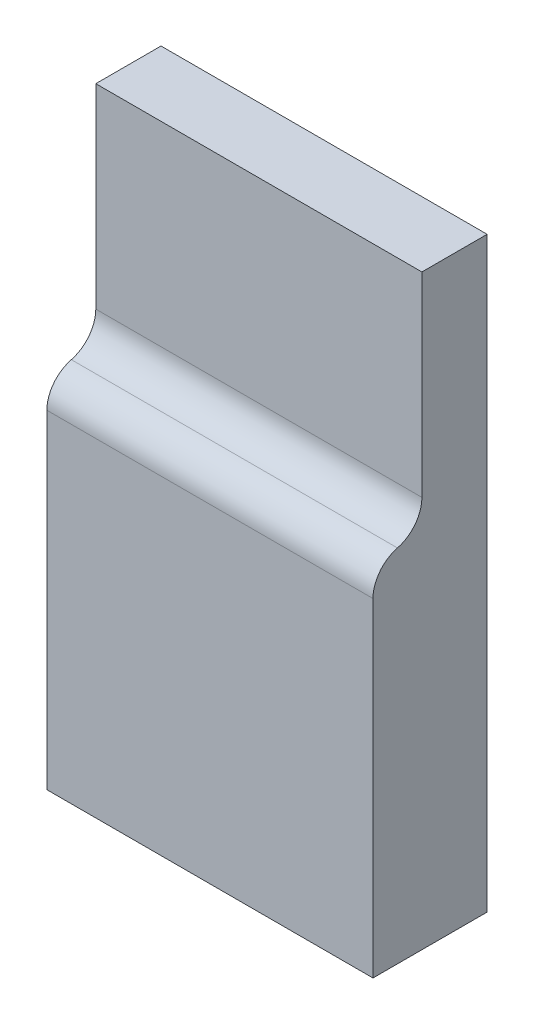
ISO-10303-21;
HEADER;
FILE_DESCRIPTION(('STEP AP214'),'2;1');
FILE_NAME('part.step','',(''),(''),'','','');
FILE_SCHEMA(('AUTOMOTIVE_DESIGN { 1 0 10303 214 1 1 1 1 }'));
ENDSEC;
DATA;
#1=APPLICATION_CONTEXT('core data for automotive mechanical design processes');
#2=APPLICATION_PROTOCOL_DEFINITION('international standard','automotive_design',2000,#1);
#3=PRODUCT_CONTEXT('',#1,'mechanical');
#4=PRODUCT('Part','Part','',(#3));
#5=PRODUCT_RELATED_PRODUCT_CATEGORY('part','',(#4));
#6=PRODUCT_DEFINITION_FORMATION('','',#4);
#7=PRODUCT_DEFINITION_CONTEXT('part definition',#1,'design');
#8=PRODUCT_DEFINITION('design','',#6,#7);
#9=PRODUCT_DEFINITION_SHAPE('','',#8);
#10=(LENGTH_UNIT() NAMED_UNIT(*) SI_UNIT(.MILLI.,.METRE.));
#11=(NAMED_UNIT(*) PLANE_ANGLE_UNIT() SI_UNIT($,.RADIAN.));
#12=(NAMED_UNIT(*) SI_UNIT($,.STERADIAN.) SOLID_ANGLE_UNIT());
#13=UNCERTAINTY_MEASURE_WITH_UNIT(LENGTH_MEASURE(1.E-05),#10,'distance_accuracy_value','');
#14=(GEOMETRIC_REPRESENTATION_CONTEXT(3) GLOBAL_UNCERTAINTY_ASSIGNED_CONTEXT((#13)) GLOBAL_UNIT_ASSIGNED_CONTEXT((#10,
#11,#12)) REPRESENTATION_CONTEXT('',''));
#15=CARTESIAN_POINT('',(0.,0.,0.));
#16=DIRECTION('',(0.,0.,1.));
#17=DIRECTION('',(1.,0.,0.));
#18=AXIS2_PLACEMENT_3D('',#15,#16,#17);
#19=CARTESIAN_POINT('',(0.,0.,20.));
#20=DIRECTION('',(0.,0.,-1.));
#21=DIRECTION('',(-1.,0.,0.));
#22=AXIS2_PLACEMENT_3D('',#19,#20,#21);
#23=PLANE('',#22);
#24=DIRECTION('',(0.,-1.,0.));
#25=VECTOR('',#24,1.);
#26=CARTESIAN_POINT('',(-50.,-90.,20.));
#27=LINE('',#26,#25);
#28=CARTESIAN_POINT('',(-50.,90.,20.));
#29=VERTEX_POINT('',#28);
#30=CARTESIAN_POINT('',(-50.,30.1375025819866,20.));
#31=VERTEX_POINT('',#30);
#32=EDGE_CURVE('E132',#29,#31,#27,.T.);
#33=ORIENTED_EDGE('',*,*,#32,.T.);
#34=DIRECTION('',(1.,0.,0.));
#35=VECTOR('',#34,1.);
#36=CARTESIAN_POINT('',(0.,30.1375025819867,20.));
#37=LINE('',#36,#35);
#38=CARTESIAN_POINT('',(50.,30.1375025819866,20.));
#39=VERTEX_POINT('',#38);
#40=EDGE_CURVE('E58',#31,#39,#37,.T.);
#41=ORIENTED_EDGE('',*,*,#40,.T.);
#42=DIRECTION('',(0.,1.,0.));
#43=VECTOR('',#42,1.);
#44=CARTESIAN_POINT('',(50.,-90.,20.));
#45=LINE('',#44,#43);
#46=CARTESIAN_POINT('',(50.,90.,20.));
#47=VERTEX_POINT('',#46);
#48=EDGE_CURVE('E127',#39,#47,#45,.T.);
#49=ORIENTED_EDGE('',*,*,#48,.T.);
#50=DIRECTION('',(-1.,0.,0.));
#51=VECTOR('',#50,1.);
#52=CARTESIAN_POINT('',(-50.,90.,20.));
#53=LINE('',#52,#51);
#54=EDGE_CURVE('E129',#47,#29,#53,.T.);
#55=ORIENTED_EDGE('',*,*,#54,.T.);
#56=EDGE_LOOP('',(#33,#41,#49,#55));
#57=FACE_BOUND('',#56,.T.);
#58=ADVANCED_FACE('F37',(#57),#23,.F.);
#59=CARTESIAN_POINT('',(50.,-90.,20.));
#60=DIRECTION('',(-1.,0.,0.));
#61=DIRECTION('',(0.,0.,1.));
#62=AXIS2_PLACEMENT_3D('',#59,#60,#61);
#63=PLANE('',#62);
#64=ORIENTED_EDGE('',*,*,#48,.F.);
#65=CARTESIAN_POINT('',(50.,30.1375025819867,30.));
#66=DIRECTION('',(-1.,0.,0.));
#67=DIRECTION('',(0.,0.,1.));
#68=AXIS2_PLACEMENT_3D('',#65,#66,#67);
#69=CIRCLE('',#68,10.);
#70=CARTESIAN_POINT('',(50.,20.4550442164681,27.5));
#71=VERTEX_POINT('',#70);
#72=EDGE_CURVE('E11',#39,#71,#69,.T.);
#73=ORIENTED_EDGE('',*,*,#72,.T.);
#74=CARTESIAN_POINT('',(50.,10.7725858509496,25.));
#75=DIRECTION('',(-1.,0.,0.));
#76=DIRECTION('',(0.,0.,1.));
#77=AXIS2_PLACEMENT_3D('',#74,#75,#76);
#78=CIRCLE('',#77,10.);
#79=CARTESIAN_POINT('',(50.,10.7725858509496,35.));
#80=VERTEX_POINT('',#79);
#81=EDGE_CURVE('E145',#71,#80,#78,.F.);
#82=ORIENTED_EDGE('',*,*,#81,.T.);
#83=DIRECTION('',(0.,1.,0.));
#84=VECTOR('',#83,1.);
#85=CARTESIAN_POINT('',(50.,20.7725858509496,35.));
#86=LINE('',#85,#84);
#87=CARTESIAN_POINT('',(50.,-90.,35.));
#88=VERTEX_POINT('',#87);
#89=EDGE_CURVE('E105',#88,#80,#86,.T.);
#90=ORIENTED_EDGE('',*,*,#89,.F.);
#91=DIRECTION('',(0.,0.,-1.));
#92=VECTOR('',#91,1.);
#93=CARTESIAN_POINT('',(50.,-90.,20.));
#94=LINE('',#93,#92);
#95=CARTESIAN_POINT('',(50.,-90.,0.));
#96=VERTEX_POINT('',#95);
#97=EDGE_CURVE('E116',#88,#96,#94,.T.);
#98=ORIENTED_EDGE('',*,*,#97,.T.);
#99=DIRECTION('',(0.,1.,0.));
#100=VECTOR('',#99,1.);
#101=CARTESIAN_POINT('',(50.,-90.,0.));
#102=LINE('',#101,#100);
#103=CARTESIAN_POINT('',(50.,90.,0.));
#104=VERTEX_POINT('',#103);
#105=EDGE_CURVE('E120',#96,#104,#102,.T.);
#106=ORIENTED_EDGE('',*,*,#105,.T.);
#107=DIRECTION('',(0.,0.,-1.));
#108=VECTOR('',#107,1.);
#109=CARTESIAN_POINT('',(50.,90.,20.));
#110=LINE('',#109,#108);
#111=EDGE_CURVE('E139',#47,#104,#110,.T.);
#112=ORIENTED_EDGE('',*,*,#111,.F.);
#113=EDGE_LOOP('',(#64,#73,#82,#90,#98,#106,#112));
#114=FACE_BOUND('',#113,.T.);
#115=ADVANCED_FACE('F157',(#114),#63,.F.);
#116=CARTESIAN_POINT('',(-50.,90.,20.));
#117=DIRECTION('',(0.,-1.,0.));
#118=DIRECTION('',(0.,0.,-1.));
#119=AXIS2_PLACEMENT_3D('',#116,#117,#118);
#120=PLANE('',#119);
#121=DIRECTION('',(-1.,0.,0.));
#122=VECTOR('',#121,1.);
#123=CARTESIAN_POINT('',(-50.,90.,0.));
#124=LINE('',#123,#122);
#125=CARTESIAN_POINT('',(-50.,90.,0.));
#126=VERTEX_POINT('',#125);
#127=EDGE_CURVE('E123',#104,#126,#124,.T.);
#128=ORIENTED_EDGE('',*,*,#127,.T.);
#129=DIRECTION('',(0.,0.,-1.));
#130=VECTOR('',#129,1.);
#131=CARTESIAN_POINT('',(-50.,90.,20.));
#132=LINE('',#131,#130);
#133=EDGE_CURVE('E115',#29,#126,#132,.T.);
#134=ORIENTED_EDGE('',*,*,#133,.F.);
#135=ORIENTED_EDGE('',*,*,#54,.F.);
#136=ORIENTED_EDGE('',*,*,#111,.T.);
#137=EDGE_LOOP('',(#128,#134,#135,#136));
#138=FACE_BOUND('',#137,.T.);
#139=ADVANCED_FACE('F162',(#138),#120,.F.);
#140=CARTESIAN_POINT('',(-50.,-90.,20.));
#141=DIRECTION('',(1.,0.,0.));
#142=DIRECTION('',(0.,0.,-1.));
#143=AXIS2_PLACEMENT_3D('',#140,#141,#142);
#144=PLANE('',#143);
#145=DIRECTION('',(0.,-1.,0.));
#146=VECTOR('',#145,1.);
#147=CARTESIAN_POINT('',(-50.,20.7725858509496,35.));
#148=LINE('',#147,#146);
#149=CARTESIAN_POINT('',(-50.,10.7725858509496,35.));
#150=VERTEX_POINT('',#149);
#151=CARTESIAN_POINT('',(-50.,-90.,35.));
#152=VERTEX_POINT('',#151);
#153=EDGE_CURVE('E96',#150,#152,#148,.T.);
#154=ORIENTED_EDGE('',*,*,#153,.F.);
#155=CARTESIAN_POINT('',(-50.,10.7725858509496,25.));
#156=DIRECTION('',(1.,0.,0.));
#157=DIRECTION('',(0.,0.,-1.));
#158=AXIS2_PLACEMENT_3D('',#155,#156,#157);
#159=CIRCLE('',#158,10.);
#160=CARTESIAN_POINT('',(-50.,20.4550442164681,27.5));
#161=VERTEX_POINT('',#160);
#162=EDGE_CURVE('E143',#150,#161,#159,.F.);
#163=ORIENTED_EDGE('',*,*,#162,.T.);
#164=CARTESIAN_POINT('',(-50.,30.1375025819867,30.));
#165=DIRECTION('',(1.,0.,0.));
#166=DIRECTION('',(0.,0.,-1.));
#167=AXIS2_PLACEMENT_3D('',#164,#165,#166);
#168=CIRCLE('',#167,10.);
#169=EDGE_CURVE('E45',#161,#31,#168,.T.);
#170=ORIENTED_EDGE('',*,*,#169,.T.);
#171=ORIENTED_EDGE('',*,*,#32,.F.);
#172=ORIENTED_EDGE('',*,*,#133,.T.);
#173=DIRECTION('',(0.,-1.,0.));
#174=VECTOR('',#173,1.);
#175=CARTESIAN_POINT('',(-50.,-90.,0.));
#176=LINE('',#175,#174);
#177=CARTESIAN_POINT('',(-50.,-90.,0.));
#178=VERTEX_POINT('',#177);
#179=EDGE_CURVE('E112',#126,#178,#176,.T.);
#180=ORIENTED_EDGE('',*,*,#179,.T.);
#181=DIRECTION('',(0.,0.,-1.));
#182=VECTOR('',#181,1.);
#183=CARTESIAN_POINT('',(-50.,-90.,20.));
#184=LINE('',#183,#182);
#185=EDGE_CURVE('E108',#152,#178,#184,.T.);
#186=ORIENTED_EDGE('',*,*,#185,.F.);
#187=EDGE_LOOP('',(#154,#163,#170,#171,#172,#180,#186));
#188=FACE_BOUND('',#187,.T.);
#189=ADVANCED_FACE('F109',(#188),#144,.F.);
#190=CARTESIAN_POINT('',(-50.,-90.,20.));
#191=DIRECTION('',(0.,1.,0.));
#192=DIRECTION('',(0.,0.,1.));
#193=AXIS2_PLACEMENT_3D('',#190,#191,#192);
#194=PLANE('',#193);
#195=DIRECTION('',(1.,0.,0.));
#196=VECTOR('',#195,1.);
#197=CARTESIAN_POINT('',(-50.,-90.,0.));
#198=LINE('',#197,#196);
#199=EDGE_CURVE('E130',#178,#96,#198,.T.);
#200=ORIENTED_EDGE('',*,*,#199,.T.);
#201=ORIENTED_EDGE('',*,*,#97,.F.);
#202=DIRECTION('',(1.,0.,0.));
#203=VECTOR('',#202,1.);
#204=CARTESIAN_POINT('',(-50.,-90.,35.));
#205=LINE('',#204,#203);
#206=EDGE_CURVE('E101',#152,#88,#205,.T.);
#207=ORIENTED_EDGE('',*,*,#206,.F.);
#208=ORIENTED_EDGE('',*,*,#185,.T.);
#209=EDGE_LOOP('',(#200,#201,#207,#208));
#210=FACE_BOUND('',#209,.T.);
#211=ADVANCED_FACE('F118',(#210),#194,.F.);
#212=CARTESIAN_POINT('',(0.,0.,0.));
#213=DIRECTION('',(0.,0.,-1.));
#214=DIRECTION('',(-1.,0.,0.));
#215=AXIS2_PLACEMENT_3D('',#212,#213,#214);
#216=PLANE('',#215);
#217=ORIENTED_EDGE('',*,*,#105,.F.);
#218=ORIENTED_EDGE('',*,*,#199,.F.);
#219=ORIENTED_EDGE('',*,*,#179,.F.);
#220=ORIENTED_EDGE('',*,*,#127,.F.);
#221=EDGE_LOOP('',(#217,#218,#219,#220));
#222=FACE_BOUND('',#221,.T.);
#223=ADVANCED_FACE('F165',(#222),#216,.T.);
#224=CARTESIAN_POINT('',(0.,0.,35.));
#225=DIRECTION('',(0.,0.,1.));
#226=DIRECTION('',(1.,0.,0.));
#227=AXIS2_PLACEMENT_3D('',#224,#225,#226);
#228=PLANE('',#227);
#229=ORIENTED_EDGE('',*,*,#89,.T.);
#230=DIRECTION('',(-1.,0.,0.));
#231=VECTOR('',#230,1.);
#232=CARTESIAN_POINT('',(-50.,10.7725858509496,35.));
#233=LINE('',#232,#231);
#234=EDGE_CURVE('E104',#80,#150,#233,.T.);
#235=ORIENTED_EDGE('',*,*,#234,.T.);
#236=ORIENTED_EDGE('',*,*,#153,.T.);
#237=ORIENTED_EDGE('',*,*,#206,.T.);
#238=EDGE_LOOP('',(#229,#235,#236,#237));
#239=FACE_BOUND('',#238,.T.);
#240=ADVANCED_FACE('F99',(#239),#228,.T.);
#241=CARTESIAN_POINT('',(0.,10.7725858509496,25.));
#242=DIRECTION('',(1.,0.,0.));
#243=DIRECTION('',(0.,0.,-1.));
#244=AXIS2_PLACEMENT_3D('',#241,#242,#243);
#245=CYLINDRICAL_SURFACE('',#244,10.);
#246=ORIENTED_EDGE('',*,*,#81,.F.);
#247=DIRECTION('',(1.,0.,0.));
#248=VECTOR('',#247,1.);
#249=CARTESIAN_POINT('',(0.,20.4550442164681,27.5));
#250=LINE('',#249,#248);
#251=EDGE_CURVE('E147',#71,#161,#250,.F.);
#252=ORIENTED_EDGE('',*,*,#251,.T.);
#253=ORIENTED_EDGE('',*,*,#162,.F.);
#254=ORIENTED_EDGE('',*,*,#234,.F.);
#255=EDGE_LOOP('',(#246,#252,#253,#254));
#256=FACE_BOUND('',#255,.T.);
#257=ADVANCED_FACE('F153',(#256),#245,.T.);
#258=CARTESIAN_POINT('',(0.,30.1375025819867,30.));
#259=DIRECTION('',(1.,0.,0.));
#260=DIRECTION('',(0.,0.,-1.));
#261=AXIS2_PLACEMENT_3D('',#258,#259,#260);
#262=CYLINDRICAL_SURFACE('',#261,10.);
#263=ORIENTED_EDGE('',*,*,#72,.F.);
#264=ORIENTED_EDGE('',*,*,#40,.F.);
#265=ORIENTED_EDGE('',*,*,#169,.F.);
#266=ORIENTED_EDGE('',*,*,#251,.F.);
#267=EDGE_LOOP('',(#263,#264,#265,#266));
#268=FACE_BOUND('',#267,.T.);
#269=ADVANCED_FACE('F39',(#268),#262,.F.);
#270=CLOSED_SHELL('',(#58,#115,#139,#189,#211,#223,#240,#257,#269));
#271=MANIFOLD_SOLID_BREP('B2',#270);
#272=ADVANCED_BREP_SHAPE_REPRESENTATION('',(#18,#271),#14);
#273=SHAPE_DEFINITION_REPRESENTATION(#9,#272);
ENDSEC;
END-ISO-10303-21;
